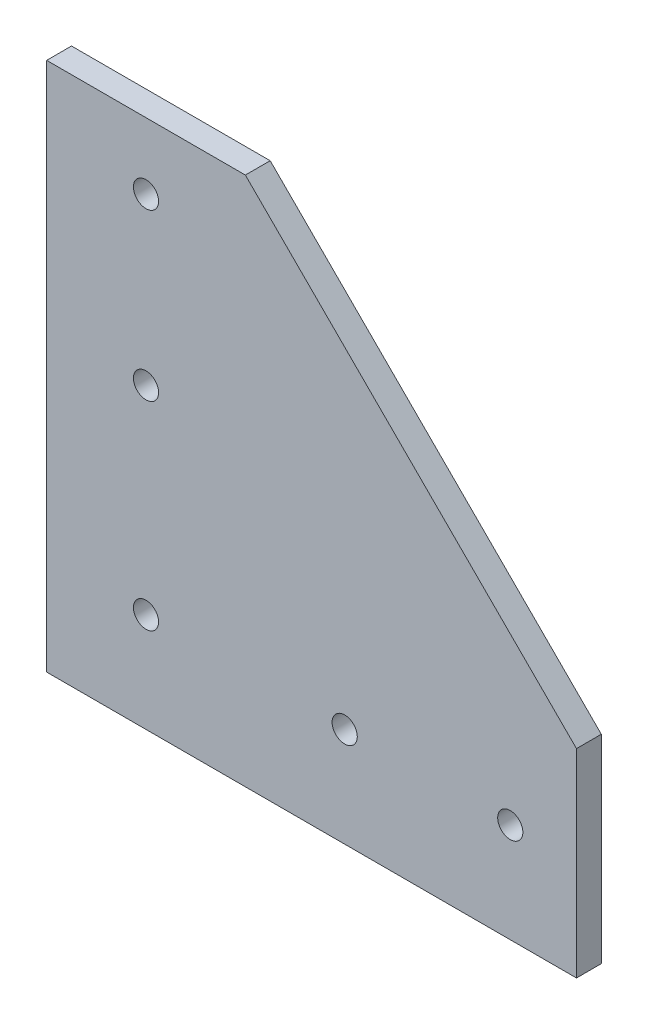
ISO-10303-21;
HEADER;
FILE_DESCRIPTION(('STEP AP214'),'2;1');
FILE_NAME('part.step','',(''),(''),'','','');
FILE_SCHEMA(('AUTOMOTIVE_DESIGN { 1 0 10303 214 1 1 1 1 }'));
ENDSEC;
DATA;
#1=APPLICATION_CONTEXT('core data for automotive mechanical design processes');
#2=APPLICATION_PROTOCOL_DEFINITION('international standard','automotive_design',2000,#1);
#3=PRODUCT_CONTEXT('',#1,'mechanical');
#4=PRODUCT('Part','Part','',(#3));
#5=PRODUCT_RELATED_PRODUCT_CATEGORY('part','',(#4));
#6=PRODUCT_DEFINITION_FORMATION('','',#4);
#7=PRODUCT_DEFINITION_CONTEXT('part definition',#1,'design');
#8=PRODUCT_DEFINITION('design','',#6,#7);
#9=PRODUCT_DEFINITION_SHAPE('','',#8);
#10=(LENGTH_UNIT() NAMED_UNIT(*) SI_UNIT(.MILLI.,.METRE.));
#11=(NAMED_UNIT(*) PLANE_ANGLE_UNIT() SI_UNIT($,.RADIAN.));
#12=(NAMED_UNIT(*) SI_UNIT($,.STERADIAN.) SOLID_ANGLE_UNIT());
#13=UNCERTAINTY_MEASURE_WITH_UNIT(LENGTH_MEASURE(1.E-05),#10,'distance_accuracy_value','');
#14=(GEOMETRIC_REPRESENTATION_CONTEXT(3) GLOBAL_UNCERTAINTY_ASSIGNED_CONTEXT((#13)) GLOBAL_UNIT_ASSIGNED_CONTEXT((#10,
#11,#12)) REPRESENTATION_CONTEXT('',''));
#15=CARTESIAN_POINT('',(0.,0.,0.));
#16=DIRECTION('',(0.,0.,1.));
#17=DIRECTION('',(1.,0.,0.));
#18=AXIS2_PLACEMENT_3D('',#15,#16,#17);
#19=CARTESIAN_POINT('',(0.,0.,4.7625));
#20=DIRECTION('',(0.,1.,0.));
#21=DIRECTION('',(0.,0.,1.));
#22=AXIS2_PLACEMENT_3D('',#19,#20,#21);
#23=PLANE('',#22);
#24=DIRECTION('',(1.,0.,0.));
#25=VECTOR('',#24,1.);
#26=CARTESIAN_POINT('',(0.,0.,0.));
#27=LINE('',#26,#25);
#28=CARTESIAN_POINT('',(0.,0.,0.));
#29=VERTEX_POINT('',#28);
#30=CARTESIAN_POINT('',(101.6,0.,0.));
#31=VERTEX_POINT('',#30);
#32=EDGE_CURVE('E129',#29,#31,#27,.T.);
#33=ORIENTED_EDGE('',*,*,#32,.T.);
#34=DIRECTION('',(0.,0.,-1.));
#35=VECTOR('',#34,1.);
#36=CARTESIAN_POINT('',(101.6,0.,4.7625));
#37=LINE('',#36,#35);
#38=CARTESIAN_POINT('',(101.6,0.,4.7625));
#39=VERTEX_POINT('',#38);
#40=EDGE_CURVE('E11',#39,#31,#37,.T.);
#41=ORIENTED_EDGE('',*,*,#40,.F.);
#42=DIRECTION('',(1.,0.,0.));
#43=VECTOR('',#42,1.);
#44=CARTESIAN_POINT('',(0.,0.,4.7625));
#45=LINE('',#44,#43);
#46=CARTESIAN_POINT('',(0.,0.,4.7625));
#47=VERTEX_POINT('',#46);
#48=EDGE_CURVE('E307',#47,#39,#45,.T.);
#49=ORIENTED_EDGE('',*,*,#48,.F.);
#50=DIRECTION('',(0.,0.,-1.));
#51=VECTOR('',#50,1.);
#52=CARTESIAN_POINT('',(0.,0.,4.7625));
#53=LINE('',#52,#51);
#54=EDGE_CURVE('E56',#47,#29,#53,.T.);
#55=ORIENTED_EDGE('',*,*,#54,.T.);
#56=EDGE_LOOP('',(#33,#41,#49,#55));
#57=FACE_BOUND('',#56,.T.);
#58=ADVANCED_FACE('F39',(#57),#23,.F.);
#59=CARTESIAN_POINT('',(101.6,0.,4.7625));
#60=DIRECTION('',(-1.,0.,0.));
#61=DIRECTION('',(0.,0.,1.));
#62=AXIS2_PLACEMENT_3D('',#59,#60,#61);
#63=PLANE('',#62);
#64=DIRECTION('',(0.,1.,0.));
#65=VECTOR('',#64,1.);
#66=CARTESIAN_POINT('',(101.6,0.,0.));
#67=LINE('',#66,#65);
#68=CARTESIAN_POINT('',(101.6,38.1,0.));
#69=VERTEX_POINT('',#68);
#70=EDGE_CURVE('E131',#31,#69,#67,.T.);
#71=ORIENTED_EDGE('',*,*,#70,.T.);
#72=DIRECTION('',(0.,0.,-1.));
#73=VECTOR('',#72,1.);
#74=CARTESIAN_POINT('',(101.6,38.1,4.7625));
#75=LINE('',#74,#73);
#76=CARTESIAN_POINT('',(101.6,38.1,4.7625));
#77=VERTEX_POINT('',#76);
#78=EDGE_CURVE('E48',#77,#69,#75,.T.);
#79=ORIENTED_EDGE('',*,*,#78,.F.);
#80=DIRECTION('',(0.,1.,0.));
#81=VECTOR('',#80,1.);
#82=CARTESIAN_POINT('',(101.6,0.,4.7625));
#83=LINE('',#82,#81);
#84=EDGE_CURVE('E85',#39,#77,#83,.T.);
#85=ORIENTED_EDGE('',*,*,#84,.F.);
#86=ORIENTED_EDGE('',*,*,#40,.T.);
#87=EDGE_LOOP('',(#71,#79,#85,#86));
#88=FACE_BOUND('',#87,.T.);
#89=ADVANCED_FACE('F142',(#88),#63,.F.);
#90=CARTESIAN_POINT('',(69.85,69.85,4.7625));
#91=DIRECTION('',(0.707106781186548,0.707106781186548,0.));
#92=DIRECTION('',(-0.707106781186548,0.707106781186548,0.));
#93=AXIS2_PLACEMENT_3D('',#90,#91,#92);
#94=PLANE('',#93);
#95=DIRECTION('',(0.707106781186548,-0.707106781186548,0.));
#96=VECTOR('',#95,1.);
#97=CARTESIAN_POINT('',(69.85,69.85,0.));
#98=LINE('',#97,#96);
#99=CARTESIAN_POINT('',(38.1,101.6,0.));
#100=VERTEX_POINT('',#99);
#101=EDGE_CURVE('E97',#100,#69,#98,.T.);
#102=ORIENTED_EDGE('',*,*,#101,.F.);
#103=DIRECTION('',(0.,0.,-1.));
#104=VECTOR('',#103,1.);
#105=CARTESIAN_POINT('',(38.1,101.6,4.7625));
#106=LINE('',#105,#104);
#107=CARTESIAN_POINT('',(38.1,101.6,4.7625));
#108=VERTEX_POINT('',#107);
#109=EDGE_CURVE('E92',#108,#100,#106,.T.);
#110=ORIENTED_EDGE('',*,*,#109,.F.);
#111=DIRECTION('',(0.707106781186548,-0.707106781186548,0.));
#112=VECTOR('',#111,1.);
#113=CARTESIAN_POINT('',(69.85,69.85,4.7625));
#114=LINE('',#113,#112);
#115=EDGE_CURVE('E95',#108,#77,#114,.T.);
#116=ORIENTED_EDGE('',*,*,#115,.T.);
#117=ORIENTED_EDGE('',*,*,#78,.T.);
#118=EDGE_LOOP('',(#102,#110,#116,#117));
#119=FACE_BOUND('',#118,.T.);
#120=ADVANCED_FACE('F94',(#119),#94,.T.);
#121=CARTESIAN_POINT('',(0.,101.6,4.7625));
#122=DIRECTION('',(0.,1.,0.));
#123=DIRECTION('',(0.,0.,1.));
#124=AXIS2_PLACEMENT_3D('',#121,#122,#123);
#125=PLANE('',#124);
#126=DIRECTION('',(1.,0.,0.));
#127=VECTOR('',#126,1.);
#128=CARTESIAN_POINT('',(0.,101.6,0.));
#129=LINE('',#128,#127);
#130=CARTESIAN_POINT('',(0.,101.6,0.));
#131=VERTEX_POINT('',#130);
#132=EDGE_CURVE('E135',#131,#100,#129,.T.);
#133=ORIENTED_EDGE('',*,*,#132,.F.);
#134=DIRECTION('',(0.,0.,-1.));
#135=VECTOR('',#134,1.);
#136=CARTESIAN_POINT('',(0.,101.6,4.7625));
#137=LINE('',#136,#135);
#138=CARTESIAN_POINT('',(0.,101.6,4.7625));
#139=VERTEX_POINT('',#138);
#140=EDGE_CURVE('E73',#139,#131,#137,.T.);
#141=ORIENTED_EDGE('',*,*,#140,.F.);
#142=DIRECTION('',(1.,0.,0.));
#143=VECTOR('',#142,1.);
#144=CARTESIAN_POINT('',(0.,101.6,4.7625));
#145=LINE('',#144,#143);
#146=EDGE_CURVE('E106',#139,#108,#145,.T.);
#147=ORIENTED_EDGE('',*,*,#146,.T.);
#148=ORIENTED_EDGE('',*,*,#109,.T.);
#149=EDGE_LOOP('',(#133,#141,#147,#148));
#150=FACE_BOUND('',#149,.T.);
#151=ADVANCED_FACE('F108',(#150),#125,.T.);
#152=CARTESIAN_POINT('',(19.05,19.05,4.7625));
#153=DIRECTION('',(0.,0.,-1.));
#154=DIRECTION('',(-1.,0.,0.));
#155=AXIS2_PLACEMENT_3D('',#152,#153,#154);
#156=CYLINDRICAL_SURFACE('',#155,2.413);
#157=CARTESIAN_POINT('',(19.05,19.05,4.7625));
#158=DIRECTION('',(0.,0.,1.));
#159=DIRECTION('',(1.,0.,0.));
#160=AXIS2_PLACEMENT_3D('',#157,#158,#159);
#161=CIRCLE('',#160,2.413);
#162=CARTESIAN_POINT('',(16.637,19.05,4.7625));
#163=VERTEX_POINT('',#162);
#164=EDGE_CURVE('E304',#163,#163,#161,.T.);
#165=CARTESIAN_POINT('',(19.05,19.05,0.));
#166=DIRECTION('',(0.,0.,1.));
#167=DIRECTION('',(1.,0.,0.));
#168=AXIS2_PLACEMENT_3D('',#165,#166,#167);
#169=CIRCLE('',#168,2.413);
#170=CARTESIAN_POINT('',(16.637,19.05,0.));
#171=VERTEX_POINT('',#170);
#172=EDGE_CURVE('E126',#171,#171,#169,.T.);
#173=CARTESIAN_POINT('',(16.637,19.05,4.7625));
#174=CARTESIAN_POINT('',(16.637,19.05,4.712890625));
#175=CARTESIAN_POINT('',(16.637,19.05,4.66328125));
#176=CARTESIAN_POINT('',(16.637,19.05,4.5640625));
#177=CARTESIAN_POINT('',(16.637,19.05,4.514453125));
#178=CARTESIAN_POINT('',(16.637,19.05,4.415234375));
#179=CARTESIAN_POINT('',(16.637,19.05,4.365625));
#180=CARTESIAN_POINT('',(16.637,19.05,4.26640625));
#181=CARTESIAN_POINT('',(16.637,19.05,4.216796875));
#182=CARTESIAN_POINT('',(16.637,19.05,4.117578125));
#183=CARTESIAN_POINT('',(16.637,19.05,4.06796875));
#184=CARTESIAN_POINT('',(16.637,19.05,3.96875));
#185=CARTESIAN_POINT('',(16.637,19.05,3.919140625));
#186=CARTESIAN_POINT('',(16.637,19.05,3.819921875));
#187=CARTESIAN_POINT('',(16.637,19.05,3.7703125));
#188=CARTESIAN_POINT('',(16.637,19.05,3.67109375));
#189=CARTESIAN_POINT('',(16.637,19.05,3.621484375));
#190=CARTESIAN_POINT('',(16.637,19.05,3.522265625));
#191=CARTESIAN_POINT('',(16.637,19.05,3.47265625));
#192=CARTESIAN_POINT('',(16.637,19.05,3.3734375));
#193=CARTESIAN_POINT('',(16.637,19.05,3.323828125));
#194=CARTESIAN_POINT('',(16.637,19.05,3.224609375));
#195=CARTESIAN_POINT('',(16.637,19.05,3.175));
#196=CARTESIAN_POINT('',(16.637,19.05,3.07578125));
#197=CARTESIAN_POINT('',(16.637,19.05,3.026171875));
#198=CARTESIAN_POINT('',(16.637,19.05,2.926953125));
#199=CARTESIAN_POINT('',(16.637,19.05,2.87734375));
#200=CARTESIAN_POINT('',(16.637,19.05,2.778125));
#201=CARTESIAN_POINT('',(16.637,19.05,2.728515625));
#202=CARTESIAN_POINT('',(16.637,19.05,2.629296875));
#203=CARTESIAN_POINT('',(16.637,19.05,2.5796875));
#204=CARTESIAN_POINT('',(16.637,19.05,2.48046875));
#205=CARTESIAN_POINT('',(16.637,19.05,2.430859375));
#206=CARTESIAN_POINT('',(16.637,19.05,2.331640625));
#207=CARTESIAN_POINT('',(16.637,19.05,2.28203125));
#208=CARTESIAN_POINT('',(16.637,19.05,2.1828125));
#209=CARTESIAN_POINT('',(16.637,19.05,2.133203125));
#210=CARTESIAN_POINT('',(16.637,19.05,2.033984375));
#211=CARTESIAN_POINT('',(16.637,19.05,1.984375));
#212=CARTESIAN_POINT('',(16.637,19.05,1.88515625));
#213=CARTESIAN_POINT('',(16.637,19.05,1.835546875));
#214=CARTESIAN_POINT('',(16.637,19.05,1.736328125));
#215=CARTESIAN_POINT('',(16.637,19.05,1.68671875));
#216=CARTESIAN_POINT('',(16.637,19.05,1.5875));
#217=CARTESIAN_POINT('',(16.637,19.05,1.537890625));
#218=CARTESIAN_POINT('',(16.637,19.05,1.438671875));
#219=CARTESIAN_POINT('',(16.637,19.05,1.3890625));
#220=CARTESIAN_POINT('',(16.637,19.05,1.28984375));
#221=CARTESIAN_POINT('',(16.637,19.05,1.240234375));
#222=CARTESIAN_POINT('',(16.637,19.05,1.141015625));
#223=CARTESIAN_POINT('',(16.637,19.05,1.09140625));
#224=CARTESIAN_POINT('',(16.637,19.05,0.992187499999999));
#225=CARTESIAN_POINT('',(16.637,19.05,0.942578124999999));
#226=CARTESIAN_POINT('',(16.637,19.05,0.843359375));
#227=CARTESIAN_POINT('',(16.637,19.05,0.79375));
#228=CARTESIAN_POINT('',(16.637,19.05,0.69453125));
#229=CARTESIAN_POINT('',(16.637,19.05,0.644921875));
#230=CARTESIAN_POINT('',(16.637,19.05,0.545703125));
#231=CARTESIAN_POINT('',(16.637,19.05,0.49609375));
#232=CARTESIAN_POINT('',(16.637,19.05,0.396875));
#233=CARTESIAN_POINT('',(16.637,19.05,0.347265625));
#234=CARTESIAN_POINT('',(16.637,19.05,0.248046875));
#235=CARTESIAN_POINT('',(16.637,19.05,0.1984375));
#236=CARTESIAN_POINT('',(16.637,19.05,0.09921875));
#237=CARTESIAN_POINT('',(16.637,19.05,0.049609375));
#238=CARTESIAN_POINT('',(16.637,19.05,0.));
#239=B_SPLINE_CURVE_WITH_KNOTS('',3,(#173,#174,#175,#176,#177,#178,#179,#180,#181,#182,#183,
#184,#185,#186,#187,#188,#189,#190,#191,#192,#193,#194,#195,#196,#197,#198,#199,#200,#201,#202,
#203,#204,#205,#206,#207,#208,#209,#210,#211,#212,#213,#214,#215,#216,#217,#218,#219,#220,#221,
#222,#223,#224,#225,#226,#227,#228,#229,#230,#231,#232,#233,#234,#235,#236,#237,#238),
.UNSPECIFIED.,.F.,.F.,(4,2,2,2,2,2,2,2,2,2,2,2,2,2,2,2,2,2,2,2,2,2,2,2,2,2,2,2,2,2,2,2,4),(0.,
0.148828125,0.29765625,0.446484375,0.5953125,0.744140625,0.892968750000001,1.041796875,1.190625,
1.339453125,1.48828125,1.637109375,1.7859375,1.934765625,2.08359375,2.232421875,2.38125,
2.530078125,2.67890625,2.827734375,2.9765625,3.125390625,3.27421875,3.423046875,3.571875,
3.720703125,3.86953125,4.018359375,4.1671875,4.316015625,4.46484375,4.613671875,4.7625),.UNSPECIFIED.);
#240=EDGE_CURVE('BSEAM167',#163,#171,#239,.T.);
#241=ORIENTED_EDGE('',*,*,#164,.T.);
#242=ORIENTED_EDGE('',*,*,#172,.F.);
#243=ORIENTED_EDGE('',*,*,#240,.T.);
#244=ORIENTED_EDGE('',*,*,#240,.F.);
#245=EDGE_LOOP('',(#241,#243,#242,#244));
#246=FACE_BOUND('',#245,.T.);
#247=ADVANCED_FACE('F167',(#246),#156,.F.);
#248=CARTESIAN_POINT('',(19.05,57.15,4.7625));
#249=DIRECTION('',(0.,0.,-1.));
#250=DIRECTION('',(-1.,0.,0.));
#251=AXIS2_PLACEMENT_3D('',#248,#249,#250);
#252=CYLINDRICAL_SURFACE('',#251,2.413);
#253=CARTESIAN_POINT('',(19.05,57.15,4.7625));
#254=DIRECTION('',(0.,0.,1.));
#255=DIRECTION('',(1.,0.,0.));
#256=AXIS2_PLACEMENT_3D('',#253,#254,#255);
#257=CIRCLE('',#256,2.413);
#258=CARTESIAN_POINT('',(16.637,57.15,4.7625));
#259=VERTEX_POINT('',#258);
#260=EDGE_CURVE('E297',#259,#259,#257,.T.);
#261=CARTESIAN_POINT('',(19.05,57.15,0.));
#262=DIRECTION('',(0.,0.,1.));
#263=DIRECTION('',(1.,0.,0.));
#264=AXIS2_PLACEMENT_3D('',#261,#262,#263);
#265=CIRCLE('',#264,2.413);
#266=CARTESIAN_POINT('',(16.637,57.15,0.));
#267=VERTEX_POINT('',#266);
#268=EDGE_CURVE('E123',#267,#267,#265,.T.);
#269=CARTESIAN_POINT('',(16.637,57.15,4.7625));
#270=CARTESIAN_POINT('',(16.637,57.15,4.712890625));
#271=CARTESIAN_POINT('',(16.637,57.15,4.66328125));
#272=CARTESIAN_POINT('',(16.637,57.15,4.5640625));
#273=CARTESIAN_POINT('',(16.637,57.15,4.514453125));
#274=CARTESIAN_POINT('',(16.637,57.15,4.415234375));
#275=CARTESIAN_POINT('',(16.637,57.15,4.365625));
#276=CARTESIAN_POINT('',(16.637,57.15,4.26640625));
#277=CARTESIAN_POINT('',(16.637,57.15,4.216796875));
#278=CARTESIAN_POINT('',(16.637,57.15,4.117578125));
#279=CARTESIAN_POINT('',(16.637,57.15,4.06796875));
#280=CARTESIAN_POINT('',(16.637,57.15,3.96875));
#281=CARTESIAN_POINT('',(16.637,57.15,3.919140625));
#282=CARTESIAN_POINT('',(16.637,57.15,3.819921875));
#283=CARTESIAN_POINT('',(16.637,57.15,3.7703125));
#284=CARTESIAN_POINT('',(16.637,57.15,3.67109375));
#285=CARTESIAN_POINT('',(16.637,57.15,3.621484375));
#286=CARTESIAN_POINT('',(16.637,57.15,3.522265625));
#287=CARTESIAN_POINT('',(16.637,57.15,3.47265625));
#288=CARTESIAN_POINT('',(16.637,57.15,3.3734375));
#289=CARTESIAN_POINT('',(16.637,57.15,3.323828125));
#290=CARTESIAN_POINT('',(16.637,57.15,3.224609375));
#291=CARTESIAN_POINT('',(16.637,57.15,3.175));
#292=CARTESIAN_POINT('',(16.637,57.15,3.07578125));
#293=CARTESIAN_POINT('',(16.637,57.15,3.026171875));
#294=CARTESIAN_POINT('',(16.637,57.15,2.926953125));
#295=CARTESIAN_POINT('',(16.637,57.15,2.87734375));
#296=CARTESIAN_POINT('',(16.637,57.15,2.778125));
#297=CARTESIAN_POINT('',(16.637,57.15,2.728515625));
#298=CARTESIAN_POINT('',(16.637,57.15,2.629296875));
#299=CARTESIAN_POINT('',(16.637,57.15,2.5796875));
#300=CARTESIAN_POINT('',(16.637,57.15,2.48046875));
#301=CARTESIAN_POINT('',(16.637,57.15,2.430859375));
#302=CARTESIAN_POINT('',(16.637,57.15,2.331640625));
#303=CARTESIAN_POINT('',(16.637,57.15,2.28203125));
#304=CARTESIAN_POINT('',(16.637,57.15,2.1828125));
#305=CARTESIAN_POINT('',(16.637,57.15,2.133203125));
#306=CARTESIAN_POINT('',(16.637,57.15,2.033984375));
#307=CARTESIAN_POINT('',(16.637,57.15,1.984375));
#308=CARTESIAN_POINT('',(16.637,57.15,1.88515625));
#309=CARTESIAN_POINT('',(16.637,57.15,1.835546875));
#310=CARTESIAN_POINT('',(16.637,57.15,1.736328125));
#311=CARTESIAN_POINT('',(16.637,57.15,1.68671875));
#312=CARTESIAN_POINT('',(16.637,57.15,1.5875));
#313=CARTESIAN_POINT('',(16.637,57.15,1.537890625));
#314=CARTESIAN_POINT('',(16.637,57.15,1.438671875));
#315=CARTESIAN_POINT('',(16.637,57.15,1.3890625));
#316=CARTESIAN_POINT('',(16.637,57.15,1.28984375));
#317=CARTESIAN_POINT('',(16.637,57.15,1.240234375));
#318=CARTESIAN_POINT('',(16.637,57.15,1.141015625));
#319=CARTESIAN_POINT('',(16.637,57.15,1.09140625));
#320=CARTESIAN_POINT('',(16.637,57.15,0.992187499999999));
#321=CARTESIAN_POINT('',(16.637,57.15,0.942578124999999));
#322=CARTESIAN_POINT('',(16.637,57.15,0.843359375));
#323=CARTESIAN_POINT('',(16.637,57.15,0.79375));
#324=CARTESIAN_POINT('',(16.637,57.15,0.69453125));
#325=CARTESIAN_POINT('',(16.637,57.15,0.644921875));
#326=CARTESIAN_POINT('',(16.637,57.15,0.545703125));
#327=CARTESIAN_POINT('',(16.637,57.15,0.49609375));
#328=CARTESIAN_POINT('',(16.637,57.15,0.396875));
#329=CARTESIAN_POINT('',(16.637,57.15,0.347265625));
#330=CARTESIAN_POINT('',(16.637,57.15,0.248046875));
#331=CARTESIAN_POINT('',(16.637,57.15,0.1984375));
#332=CARTESIAN_POINT('',(16.637,57.15,0.09921875));
#333=CARTESIAN_POINT('',(16.637,57.15,0.049609375));
#334=CARTESIAN_POINT('',(16.637,57.15,0.));
#335=B_SPLINE_CURVE_WITH_KNOTS('',3,(#269,#270,#271,#272,#273,#274,#275,#276,#277,#278,#279,
#280,#281,#282,#283,#284,#285,#286,#287,#288,#289,#290,#291,#292,#293,#294,#295,#296,#297,#298,
#299,#300,#301,#302,#303,#304,#305,#306,#307,#308,#309,#310,#311,#312,#313,#314,#315,#316,#317,
#318,#319,#320,#321,#322,#323,#324,#325,#326,#327,#328,#329,#330,#331,#332,#333,#334),
.UNSPECIFIED.,.F.,.F.,(4,2,2,2,2,2,2,2,2,2,2,2,2,2,2,2,2,2,2,2,2,2,2,2,2,2,2,2,2,2,2,2,4),(0.,
0.148828125,0.29765625,0.446484375,0.5953125,0.744140625,0.892968750000001,1.041796875,1.190625,
1.339453125,1.48828125,1.637109375,1.7859375,1.934765625,2.08359375,2.232421875,2.38125,
2.530078125,2.67890625,2.827734375,2.9765625,3.125390625,3.27421875,3.423046875,3.571875,
3.720703125,3.86953125,4.018359375,4.1671875,4.316015625,4.46484375,4.613671875,4.7625),.UNSPECIFIED.);
#336=EDGE_CURVE('BSEAM170',#259,#267,#335,.T.);
#337=ORIENTED_EDGE('',*,*,#260,.T.);
#338=ORIENTED_EDGE('',*,*,#268,.F.);
#339=ORIENTED_EDGE('',*,*,#336,.T.);
#340=ORIENTED_EDGE('',*,*,#336,.F.);
#341=EDGE_LOOP('',(#337,#339,#338,#340));
#342=FACE_BOUND('',#341,.T.);
#343=ADVANCED_FACE('F170',(#342),#252,.F.);
#344=CARTESIAN_POINT('',(19.05,88.9,4.7625));
#345=DIRECTION('',(0.,0.,-1.));
#346=DIRECTION('',(-1.,0.,0.));
#347=AXIS2_PLACEMENT_3D('',#344,#345,#346);
#348=CYLINDRICAL_SURFACE('',#347,2.413);
#349=CARTESIAN_POINT('',(19.05,88.9,4.7625));
#350=DIRECTION('',(0.,0.,1.));
#351=DIRECTION('',(1.,0.,0.));
#352=AXIS2_PLACEMENT_3D('',#349,#350,#351);
#353=CIRCLE('',#352,2.413);
#354=CARTESIAN_POINT('',(16.637,88.9,4.7625));
#355=VERTEX_POINT('',#354);
#356=EDGE_CURVE('E294',#355,#355,#353,.T.);
#357=CARTESIAN_POINT('',(19.05,88.9,0.));
#358=DIRECTION('',(0.,0.,1.));
#359=DIRECTION('',(1.,0.,0.));
#360=AXIS2_PLACEMENT_3D('',#357,#358,#359);
#361=CIRCLE('',#360,2.413);
#362=CARTESIAN_POINT('',(16.637,88.9,0.));
#363=VERTEX_POINT('',#362);
#364=EDGE_CURVE('E120',#363,#363,#361,.T.);
#365=CARTESIAN_POINT('',(16.637,88.9,4.7625));
#366=CARTESIAN_POINT('',(16.637,88.9,4.712890625));
#367=CARTESIAN_POINT('',(16.637,88.9,4.66328125));
#368=CARTESIAN_POINT('',(16.637,88.9,4.5640625));
#369=CARTESIAN_POINT('',(16.637,88.9,4.514453125));
#370=CARTESIAN_POINT('',(16.637,88.9,4.415234375));
#371=CARTESIAN_POINT('',(16.637,88.9,4.365625));
#372=CARTESIAN_POINT('',(16.637,88.9,4.26640625));
#373=CARTESIAN_POINT('',(16.637,88.9,4.216796875));
#374=CARTESIAN_POINT('',(16.637,88.9,4.117578125));
#375=CARTESIAN_POINT('',(16.637,88.9,4.06796875));
#376=CARTESIAN_POINT('',(16.637,88.9,3.96875));
#377=CARTESIAN_POINT('',(16.637,88.9,3.919140625));
#378=CARTESIAN_POINT('',(16.637,88.9,3.819921875));
#379=CARTESIAN_POINT('',(16.637,88.9,3.7703125));
#380=CARTESIAN_POINT('',(16.637,88.9,3.67109375));
#381=CARTESIAN_POINT('',(16.637,88.9,3.621484375));
#382=CARTESIAN_POINT('',(16.637,88.9,3.522265625));
#383=CARTESIAN_POINT('',(16.637,88.9,3.47265625));
#384=CARTESIAN_POINT('',(16.637,88.9,3.3734375));
#385=CARTESIAN_POINT('',(16.637,88.9,3.323828125));
#386=CARTESIAN_POINT('',(16.637,88.9,3.224609375));
#387=CARTESIAN_POINT('',(16.637,88.9,3.175));
#388=CARTESIAN_POINT('',(16.637,88.9,3.07578125));
#389=CARTESIAN_POINT('',(16.637,88.9,3.026171875));
#390=CARTESIAN_POINT('',(16.637,88.9,2.926953125));
#391=CARTESIAN_POINT('',(16.637,88.9,2.87734375));
#392=CARTESIAN_POINT('',(16.637,88.9,2.778125));
#393=CARTESIAN_POINT('',(16.637,88.9,2.728515625));
#394=CARTESIAN_POINT('',(16.637,88.9,2.629296875));
#395=CARTESIAN_POINT('',(16.637,88.9,2.5796875));
#396=CARTESIAN_POINT('',(16.637,88.9,2.48046875));
#397=CARTESIAN_POINT('',(16.637,88.9,2.430859375));
#398=CARTESIAN_POINT('',(16.637,88.9,2.331640625));
#399=CARTESIAN_POINT('',(16.637,88.9,2.28203125));
#400=CARTESIAN_POINT('',(16.637,88.9,2.1828125));
#401=CARTESIAN_POINT('',(16.637,88.9,2.133203125));
#402=CARTESIAN_POINT('',(16.637,88.9,2.033984375));
#403=CARTESIAN_POINT('',(16.637,88.9,1.984375));
#404=CARTESIAN_POINT('',(16.637,88.9,1.88515625));
#405=CARTESIAN_POINT('',(16.637,88.9,1.835546875));
#406=CARTESIAN_POINT('',(16.637,88.9,1.736328125));
#407=CARTESIAN_POINT('',(16.637,88.9,1.68671875));
#408=CARTESIAN_POINT('',(16.637,88.9,1.5875));
#409=CARTESIAN_POINT('',(16.637,88.9,1.537890625));
#410=CARTESIAN_POINT('',(16.637,88.9,1.438671875));
#411=CARTESIAN_POINT('',(16.637,88.9,1.3890625));
#412=CARTESIAN_POINT('',(16.637,88.9,1.28984375));
#413=CARTESIAN_POINT('',(16.637,88.9,1.240234375));
#414=CARTESIAN_POINT('',(16.637,88.9,1.141015625));
#415=CARTESIAN_POINT('',(16.637,88.9,1.09140625));
#416=CARTESIAN_POINT('',(16.637,88.9,0.992187499999999));
#417=CARTESIAN_POINT('',(16.637,88.9,0.942578124999999));
#418=CARTESIAN_POINT('',(16.637,88.9,0.843359375));
#419=CARTESIAN_POINT('',(16.637,88.9,0.79375));
#420=CARTESIAN_POINT('',(16.637,88.9,0.69453125));
#421=CARTESIAN_POINT('',(16.637,88.9,0.644921875));
#422=CARTESIAN_POINT('',(16.637,88.9,0.545703125));
#423=CARTESIAN_POINT('',(16.637,88.9,0.49609375));
#424=CARTESIAN_POINT('',(16.637,88.9,0.396875));
#425=CARTESIAN_POINT('',(16.637,88.9,0.347265625));
#426=CARTESIAN_POINT('',(16.637,88.9,0.248046875));
#427=CARTESIAN_POINT('',(16.637,88.9,0.1984375));
#428=CARTESIAN_POINT('',(16.637,88.9,0.09921875));
#429=CARTESIAN_POINT('',(16.637,88.9,0.049609375));
#430=CARTESIAN_POINT('',(16.637,88.9,0.));
#431=B_SPLINE_CURVE_WITH_KNOTS('',3,(#365,#366,#367,#368,#369,#370,#371,#372,#373,#374,#375,
#376,#377,#378,#379,#380,#381,#382,#383,#384,#385,#386,#387,#388,#389,#390,#391,#392,#393,#394,
#395,#396,#397,#398,#399,#400,#401,#402,#403,#404,#405,#406,#407,#408,#409,#410,#411,#412,#413,
#414,#415,#416,#417,#418,#419,#420,#421,#422,#423,#424,#425,#426,#427,#428,#429,#430),
.UNSPECIFIED.,.F.,.F.,(4,2,2,2,2,2,2,2,2,2,2,2,2,2,2,2,2,2,2,2,2,2,2,2,2,2,2,2,2,2,2,2,4),(0.,
0.148828125,0.29765625,0.446484375,0.5953125,0.744140625,0.892968750000001,1.041796875,1.190625,
1.339453125,1.48828125,1.637109375,1.7859375,1.934765625,2.08359375,2.232421875,2.38125,
2.530078125,2.67890625,2.827734375,2.9765625,3.125390625,3.27421875,3.423046875,3.571875,
3.720703125,3.86953125,4.018359375,4.1671875,4.316015625,4.46484375,4.613671875,4.7625),.UNSPECIFIED.);
#432=EDGE_CURVE('BSEAM174',#355,#363,#431,.T.);
#433=ORIENTED_EDGE('',*,*,#356,.T.);
#434=ORIENTED_EDGE('',*,*,#364,.F.);
#435=ORIENTED_EDGE('',*,*,#432,.T.);
#436=ORIENTED_EDGE('',*,*,#432,.F.);
#437=EDGE_LOOP('',(#433,#435,#434,#436));
#438=FACE_BOUND('',#437,.T.);
#439=ADVANCED_FACE('F174',(#438),#348,.F.);
#440=CARTESIAN_POINT('',(88.9,19.05,4.7625));
#441=DIRECTION('',(0.,0.,-1.));
#442=DIRECTION('',(-1.,0.,0.));
#443=AXIS2_PLACEMENT_3D('',#440,#441,#442);
#444=CYLINDRICAL_SURFACE('',#443,2.413);
#445=CARTESIAN_POINT('',(88.9,19.05,4.7625));
#446=DIRECTION('',(0.,0.,1.));
#447=DIRECTION('',(1.,0.,0.));
#448=AXIS2_PLACEMENT_3D('',#445,#446,#447);
#449=CIRCLE('',#448,2.413);
#450=CARTESIAN_POINT('',(86.487,19.05,4.7625));
#451=VERTEX_POINT('',#450);
#452=EDGE_CURVE('E185',#451,#451,#449,.T.);
#453=CARTESIAN_POINT('',(88.9,19.05,0.));
#454=DIRECTION('',(0.,0.,1.));
#455=DIRECTION('',(1.,0.,0.));
#456=AXIS2_PLACEMENT_3D('',#453,#454,#455);
#457=CIRCLE('',#456,2.413);
#458=CARTESIAN_POINT('',(86.487,19.05,0.));
#459=VERTEX_POINT('',#458);
#460=EDGE_CURVE('E117',#459,#459,#457,.T.);
#461=CARTESIAN_POINT('',(86.487,19.05,4.7625));
#462=CARTESIAN_POINT('',(86.487,19.05,4.712890625));
#463=CARTESIAN_POINT('',(86.487,19.05,4.66328125));
#464=CARTESIAN_POINT('',(86.487,19.05,4.5640625));
#465=CARTESIAN_POINT('',(86.487,19.05,4.514453125));
#466=CARTESIAN_POINT('',(86.487,19.05,4.415234375));
#467=CARTESIAN_POINT('',(86.487,19.05,4.365625));
#468=CARTESIAN_POINT('',(86.487,19.05,4.26640625));
#469=CARTESIAN_POINT('',(86.487,19.05,4.216796875));
#470=CARTESIAN_POINT('',(86.487,19.05,4.117578125));
#471=CARTESIAN_POINT('',(86.487,19.05,4.06796875));
#472=CARTESIAN_POINT('',(86.487,19.05,3.96875));
#473=CARTESIAN_POINT('',(86.487,19.05,3.919140625));
#474=CARTESIAN_POINT('',(86.487,19.05,3.819921875));
#475=CARTESIAN_POINT('',(86.487,19.05,3.7703125));
#476=CARTESIAN_POINT('',(86.487,19.05,3.67109375));
#477=CARTESIAN_POINT('',(86.487,19.05,3.621484375));
#478=CARTESIAN_POINT('',(86.487,19.05,3.522265625));
#479=CARTESIAN_POINT('',(86.487,19.05,3.47265625));
#480=CARTESIAN_POINT('',(86.487,19.05,3.3734375));
#481=CARTESIAN_POINT('',(86.487,19.05,3.323828125));
#482=CARTESIAN_POINT('',(86.487,19.05,3.224609375));
#483=CARTESIAN_POINT('',(86.487,19.05,3.175));
#484=CARTESIAN_POINT('',(86.487,19.05,3.07578125));
#485=CARTESIAN_POINT('',(86.487,19.05,3.026171875));
#486=CARTESIAN_POINT('',(86.487,19.05,2.926953125));
#487=CARTESIAN_POINT('',(86.487,19.05,2.87734375));
#488=CARTESIAN_POINT('',(86.487,19.05,2.778125));
#489=CARTESIAN_POINT('',(86.487,19.05,2.728515625));
#490=CARTESIAN_POINT('',(86.487,19.05,2.629296875));
#491=CARTESIAN_POINT('',(86.487,19.05,2.5796875));
#492=CARTESIAN_POINT('',(86.487,19.05,2.48046875));
#493=CARTESIAN_POINT('',(86.487,19.05,2.430859375));
#494=CARTESIAN_POINT('',(86.487,19.05,2.331640625));
#495=CARTESIAN_POINT('',(86.487,19.05,2.28203125));
#496=CARTESIAN_POINT('',(86.487,19.05,2.1828125));
#497=CARTESIAN_POINT('',(86.487,19.05,2.133203125));
#498=CARTESIAN_POINT('',(86.487,19.05,2.033984375));
#499=CARTESIAN_POINT('',(86.487,19.05,1.984375));
#500=CARTESIAN_POINT('',(86.487,19.05,1.88515625));
#501=CARTESIAN_POINT('',(86.487,19.05,1.835546875));
#502=CARTESIAN_POINT('',(86.487,19.05,1.736328125));
#503=CARTESIAN_POINT('',(86.487,19.05,1.68671875));
#504=CARTESIAN_POINT('',(86.487,19.05,1.5875));
#505=CARTESIAN_POINT('',(86.487,19.05,1.537890625));
#506=CARTESIAN_POINT('',(86.487,19.05,1.438671875));
#507=CARTESIAN_POINT('',(86.487,19.05,1.3890625));
#508=CARTESIAN_POINT('',(86.487,19.05,1.28984375));
#509=CARTESIAN_POINT('',(86.487,19.05,1.240234375));
#510=CARTESIAN_POINT('',(86.487,19.05,1.141015625));
#511=CARTESIAN_POINT('',(86.487,19.05,1.09140625));
#512=CARTESIAN_POINT('',(86.487,19.05,0.992187499999999));
#513=CARTESIAN_POINT('',(86.487,19.05,0.942578124999999));
#514=CARTESIAN_POINT('',(86.487,19.05,0.843359375));
#515=CARTESIAN_POINT('',(86.487,19.05,0.79375));
#516=CARTESIAN_POINT('',(86.487,19.05,0.69453125));
#517=CARTESIAN_POINT('',(86.487,19.05,0.644921875));
#518=CARTESIAN_POINT('',(86.487,19.05,0.545703125));
#519=CARTESIAN_POINT('',(86.487,19.05,0.49609375));
#520=CARTESIAN_POINT('',(86.487,19.05,0.396875));
#521=CARTESIAN_POINT('',(86.487,19.05,0.347265625));
#522=CARTESIAN_POINT('',(86.487,19.05,0.248046875));
#523=CARTESIAN_POINT('',(86.487,19.05,0.1984375));
#524=CARTESIAN_POINT('',(86.487,19.05,0.09921875));
#525=CARTESIAN_POINT('',(86.487,19.05,0.049609375));
#526=CARTESIAN_POINT('',(86.487,19.05,0.));
#527=B_SPLINE_CURVE_WITH_KNOTS('',3,(#461,#462,#463,#464,#465,#466,#467,#468,#469,#470,#471,
#472,#473,#474,#475,#476,#477,#478,#479,#480,#481,#482,#483,#484,#485,#486,#487,#488,#489,#490,
#491,#492,#493,#494,#495,#496,#497,#498,#499,#500,#501,#502,#503,#504,#505,#506,#507,#508,#509,
#510,#511,#512,#513,#514,#515,#516,#517,#518,#519,#520,#521,#522,#523,#524,#525,#526),
.UNSPECIFIED.,.F.,.F.,(4,2,2,2,2,2,2,2,2,2,2,2,2,2,2,2,2,2,2,2,2,2,2,2,2,2,2,2,2,2,2,2,4),(0.,
0.148828125,0.29765625,0.446484375,0.5953125,0.744140625,0.892968750000001,1.041796875,1.190625,
1.339453125,1.48828125,1.637109375,1.7859375,1.934765625,2.08359375,2.232421875,2.38125,
2.530078125,2.67890625,2.827734375,2.9765625,3.125390625,3.27421875,3.423046875,3.571875,
3.720703125,3.86953125,4.018359375,4.1671875,4.316015625,4.46484375,4.613671875,4.7625),.UNSPECIFIED.);
#528=EDGE_CURVE('BSEAM155',#451,#459,#527,.T.);
#529=ORIENTED_EDGE('',*,*,#452,.T.);
#530=ORIENTED_EDGE('',*,*,#460,.F.);
#531=ORIENTED_EDGE('',*,*,#528,.T.);
#532=ORIENTED_EDGE('',*,*,#528,.F.);
#533=EDGE_LOOP('',(#529,#531,#530,#532));
#534=FACE_BOUND('',#533,.T.);
#535=ADVANCED_FACE('F155',(#534),#444,.F.);
#536=CARTESIAN_POINT('',(57.15,19.05,4.7625));
#537=DIRECTION('',(0.,0.,-1.));
#538=DIRECTION('',(-1.,0.,0.));
#539=AXIS2_PLACEMENT_3D('',#536,#537,#538);
#540=CYLINDRICAL_SURFACE('',#539,2.413);
#541=CARTESIAN_POINT('',(57.15,19.05,4.7625));
#542=DIRECTION('',(0.,0.,1.));
#543=DIRECTION('',(1.,0.,0.));
#544=AXIS2_PLACEMENT_3D('',#541,#542,#543);
#545=CIRCLE('',#544,2.413);
#546=CARTESIAN_POINT('',(54.737,19.05,4.7625));
#547=VERTEX_POINT('',#546);
#548=EDGE_CURVE('E140',#547,#547,#545,.T.);
#549=CARTESIAN_POINT('',(57.15,19.05,0.));
#550=DIRECTION('',(0.,0.,1.));
#551=DIRECTION('',(1.,0.,0.));
#552=AXIS2_PLACEMENT_3D('',#549,#550,#551);
#553=CIRCLE('',#552,2.413);
#554=CARTESIAN_POINT('',(54.737,19.05,0.));
#555=VERTEX_POINT('',#554);
#556=EDGE_CURVE('E114',#555,#555,#553,.T.);
#557=CARTESIAN_POINT('',(54.737,19.05,4.7625));
#558=CARTESIAN_POINT('',(54.737,19.05,4.712890625));
#559=CARTESIAN_POINT('',(54.737,19.05,4.66328125));
#560=CARTESIAN_POINT('',(54.737,19.05,4.5640625));
#561=CARTESIAN_POINT('',(54.737,19.05,4.514453125));
#562=CARTESIAN_POINT('',(54.737,19.05,4.415234375));
#563=CARTESIAN_POINT('',(54.737,19.05,4.365625));
#564=CARTESIAN_POINT('',(54.737,19.05,4.26640625));
#565=CARTESIAN_POINT('',(54.737,19.05,4.216796875));
#566=CARTESIAN_POINT('',(54.737,19.05,4.117578125));
#567=CARTESIAN_POINT('',(54.737,19.05,4.06796875));
#568=CARTESIAN_POINT('',(54.737,19.05,3.96875));
#569=CARTESIAN_POINT('',(54.737,19.05,3.919140625));
#570=CARTESIAN_POINT('',(54.737,19.05,3.819921875));
#571=CARTESIAN_POINT('',(54.737,19.05,3.7703125));
#572=CARTESIAN_POINT('',(54.737,19.05,3.67109375));
#573=CARTESIAN_POINT('',(54.737,19.05,3.621484375));
#574=CARTESIAN_POINT('',(54.737,19.05,3.522265625));
#575=CARTESIAN_POINT('',(54.737,19.05,3.47265625));
#576=CARTESIAN_POINT('',(54.737,19.05,3.3734375));
#577=CARTESIAN_POINT('',(54.737,19.05,3.323828125));
#578=CARTESIAN_POINT('',(54.737,19.05,3.224609375));
#579=CARTESIAN_POINT('',(54.737,19.05,3.175));
#580=CARTESIAN_POINT('',(54.737,19.05,3.07578125));
#581=CARTESIAN_POINT('',(54.737,19.05,3.026171875));
#582=CARTESIAN_POINT('',(54.737,19.05,2.926953125));
#583=CARTESIAN_POINT('',(54.737,19.05,2.87734375));
#584=CARTESIAN_POINT('',(54.737,19.05,2.778125));
#585=CARTESIAN_POINT('',(54.737,19.05,2.728515625));
#586=CARTESIAN_POINT('',(54.737,19.05,2.629296875));
#587=CARTESIAN_POINT('',(54.737,19.05,2.5796875));
#588=CARTESIAN_POINT('',(54.737,19.05,2.48046875));
#589=CARTESIAN_POINT('',(54.737,19.05,2.430859375));
#590=CARTESIAN_POINT('',(54.737,19.05,2.331640625));
#591=CARTESIAN_POINT('',(54.737,19.05,2.28203125));
#592=CARTESIAN_POINT('',(54.737,19.05,2.1828125));
#593=CARTESIAN_POINT('',(54.737,19.05,2.133203125));
#594=CARTESIAN_POINT('',(54.737,19.05,2.033984375));
#595=CARTESIAN_POINT('',(54.737,19.05,1.984375));
#596=CARTESIAN_POINT('',(54.737,19.05,1.88515625));
#597=CARTESIAN_POINT('',(54.737,19.05,1.835546875));
#598=CARTESIAN_POINT('',(54.737,19.05,1.736328125));
#599=CARTESIAN_POINT('',(54.737,19.05,1.68671875));
#600=CARTESIAN_POINT('',(54.737,19.05,1.5875));
#601=CARTESIAN_POINT('',(54.737,19.05,1.537890625));
#602=CARTESIAN_POINT('',(54.737,19.05,1.438671875));
#603=CARTESIAN_POINT('',(54.737,19.05,1.3890625));
#604=CARTESIAN_POINT('',(54.737,19.05,1.28984375));
#605=CARTESIAN_POINT('',(54.737,19.05,1.240234375));
#606=CARTESIAN_POINT('',(54.737,19.05,1.141015625));
#607=CARTESIAN_POINT('',(54.737,19.05,1.09140625));
#608=CARTESIAN_POINT('',(54.737,19.05,0.992187499999999));
#609=CARTESIAN_POINT('',(54.737,19.05,0.942578124999999));
#610=CARTESIAN_POINT('',(54.737,19.05,0.843359375));
#611=CARTESIAN_POINT('',(54.737,19.05,0.79375));
#612=CARTESIAN_POINT('',(54.737,19.05,0.69453125));
#613=CARTESIAN_POINT('',(54.737,19.05,0.644921875));
#614=CARTESIAN_POINT('',(54.737,19.05,0.545703125));
#615=CARTESIAN_POINT('',(54.737,19.05,0.49609375));
#616=CARTESIAN_POINT('',(54.737,19.05,0.396875));
#617=CARTESIAN_POINT('',(54.737,19.05,0.347265625));
#618=CARTESIAN_POINT('',(54.737,19.05,0.248046875));
#619=CARTESIAN_POINT('',(54.737,19.05,0.1984375));
#620=CARTESIAN_POINT('',(54.737,19.05,0.09921875));
#621=CARTESIAN_POINT('',(54.737,19.05,0.049609375));
#622=CARTESIAN_POINT('',(54.737,19.05,0.));
#623=B_SPLINE_CURVE_WITH_KNOTS('',3,(#557,#558,#559,#560,#561,#562,#563,#564,#565,#566,#567,
#568,#569,#570,#571,#572,#573,#574,#575,#576,#577,#578,#579,#580,#581,#582,#583,#584,#585,#586,
#587,#588,#589,#590,#591,#592,#593,#594,#595,#596,#597,#598,#599,#600,#601,#602,#603,#604,#605,
#606,#607,#608,#609,#610,#611,#612,#613,#614,#615,#616,#617,#618,#619,#620,#621,#622),
.UNSPECIFIED.,.F.,.F.,(4,2,2,2,2,2,2,2,2,2,2,2,2,2,2,2,2,2,2,2,2,2,2,2,2,2,2,2,2,2,2,2,4),(0.,
0.148828125,0.29765625,0.446484375,0.5953125,0.744140625,0.892968750000001,1.041796875,1.190625,
1.339453125,1.48828125,1.637109375,1.7859375,1.934765625,2.08359375,2.232421875,2.38125,
2.530078125,2.67890625,2.827734375,2.9765625,3.125390625,3.27421875,3.423046875,3.571875,
3.720703125,3.86953125,4.018359375,4.1671875,4.316015625,4.46484375,4.613671875,4.7625),.UNSPECIFIED.);
#624=EDGE_CURVE('BSEAM41',#547,#555,#623,.T.);
#625=ORIENTED_EDGE('',*,*,#548,.T.);
#626=ORIENTED_EDGE('',*,*,#556,.F.);
#627=ORIENTED_EDGE('',*,*,#624,.T.);
#628=ORIENTED_EDGE('',*,*,#624,.F.);
#629=EDGE_LOOP('',(#625,#627,#626,#628));
#630=FACE_BOUND('',#629,.T.);
#631=ADVANCED_FACE('F41',(#630),#540,.F.);
#632=CARTESIAN_POINT('',(0.,0.,4.7625));
#633=DIRECTION('',(-1.,0.,0.));
#634=DIRECTION('',(0.,0.,1.));
#635=AXIS2_PLACEMENT_3D('',#632,#633,#634);
#636=PLANE('',#635);
#637=DIRECTION('',(0.,1.,0.));
#638=VECTOR('',#637,1.);
#639=CARTESIAN_POINT('',(0.,0.,0.));
#640=LINE('',#639,#638);
#641=EDGE_CURVE('E137',#29,#131,#640,.T.);
#642=ORIENTED_EDGE('',*,*,#641,.F.);
#643=ORIENTED_EDGE('',*,*,#54,.F.);
#644=DIRECTION('',(0.,1.,0.));
#645=VECTOR('',#644,1.);
#646=CARTESIAN_POINT('',(0.,0.,4.7625));
#647=LINE('',#646,#645);
#648=EDGE_CURVE('E109',#47,#139,#647,.T.);
#649=ORIENTED_EDGE('',*,*,#648,.T.);
#650=ORIENTED_EDGE('',*,*,#140,.T.);
#651=EDGE_LOOP('',(#642,#643,#649,#650));
#652=FACE_BOUND('',#651,.T.);
#653=ADVANCED_FACE('F146',(#652),#636,.T.);
#654=CARTESIAN_POINT('',(0.,0.,4.7625));
#655=DIRECTION('',(0.,0.,1.));
#656=DIRECTION('',(1.,0.,0.));
#657=AXIS2_PLACEMENT_3D('',#654,#655,#656);
#658=PLANE('',#657);
#659=ORIENTED_EDGE('',*,*,#548,.F.);
#660=EDGE_LOOP('',(#659));
#661=FACE_BOUND('',#660,.T.);
#662=ORIENTED_EDGE('',*,*,#452,.F.);
#663=EDGE_LOOP('',(#662));
#664=FACE_BOUND('',#663,.T.);
#665=ORIENTED_EDGE('',*,*,#356,.F.);
#666=EDGE_LOOP('',(#665));
#667=FACE_BOUND('',#666,.T.);
#668=ORIENTED_EDGE('',*,*,#260,.F.);
#669=EDGE_LOOP('',(#668));
#670=FACE_BOUND('',#669,.T.);
#671=ORIENTED_EDGE('',*,*,#164,.F.);
#672=EDGE_LOOP('',(#671));
#673=FACE_BOUND('',#672,.T.);
#674=ORIENTED_EDGE('',*,*,#48,.T.);
#675=ORIENTED_EDGE('',*,*,#84,.T.);
#676=ORIENTED_EDGE('',*,*,#115,.F.);
#677=ORIENTED_EDGE('',*,*,#146,.F.);
#678=ORIENTED_EDGE('',*,*,#648,.F.);
#679=EDGE_LOOP('',(#674,#675,#676,#677,#678));
#680=FACE_BOUND('',#679,.T.);
#681=ADVANCED_FACE('F104',(#661,#664,#667,#670,#673,#680),#658,.T.);
#682=CARTESIAN_POINT('',(0.,0.,0.));
#683=DIRECTION('',(0.,0.,1.));
#684=DIRECTION('',(1.,0.,0.));
#685=AXIS2_PLACEMENT_3D('',#682,#683,#684);
#686=PLANE('',#685);
#687=ORIENTED_EDGE('',*,*,#556,.T.);
#688=EDGE_LOOP('',(#687));
#689=FACE_BOUND('',#688,.T.);
#690=ORIENTED_EDGE('',*,*,#460,.T.);
#691=EDGE_LOOP('',(#690));
#692=FACE_BOUND('',#691,.T.);
#693=ORIENTED_EDGE('',*,*,#364,.T.);
#694=EDGE_LOOP('',(#693));
#695=FACE_BOUND('',#694,.T.);
#696=ORIENTED_EDGE('',*,*,#268,.T.);
#697=EDGE_LOOP('',(#696));
#698=FACE_BOUND('',#697,.T.);
#699=ORIENTED_EDGE('',*,*,#172,.T.);
#700=EDGE_LOOP('',(#699));
#701=FACE_BOUND('',#700,.T.);
#702=ORIENTED_EDGE('',*,*,#32,.F.);
#703=ORIENTED_EDGE('',*,*,#641,.T.);
#704=ORIENTED_EDGE('',*,*,#132,.T.);
#705=ORIENTED_EDGE('',*,*,#101,.T.);
#706=ORIENTED_EDGE('',*,*,#70,.F.);
#707=EDGE_LOOP('',(#702,#703,#704,#705,#706));
#708=FACE_BOUND('',#707,.T.);
#709=ADVANCED_FACE('F145',(#689,#692,#695,#698,#701,#708),#686,.F.);
#710=CLOSED_SHELL('',(#58,#89,#120,#151,#247,#343,#439,#535,#631,#653,#681,#709));
#711=MANIFOLD_SOLID_BREP('B2',#710);
#712=ADVANCED_BREP_SHAPE_REPRESENTATION('',(#18,#711),#14);
#713=SHAPE_DEFINITION_REPRESENTATION(#9,#712);
ENDSEC;
END-ISO-10303-21;
